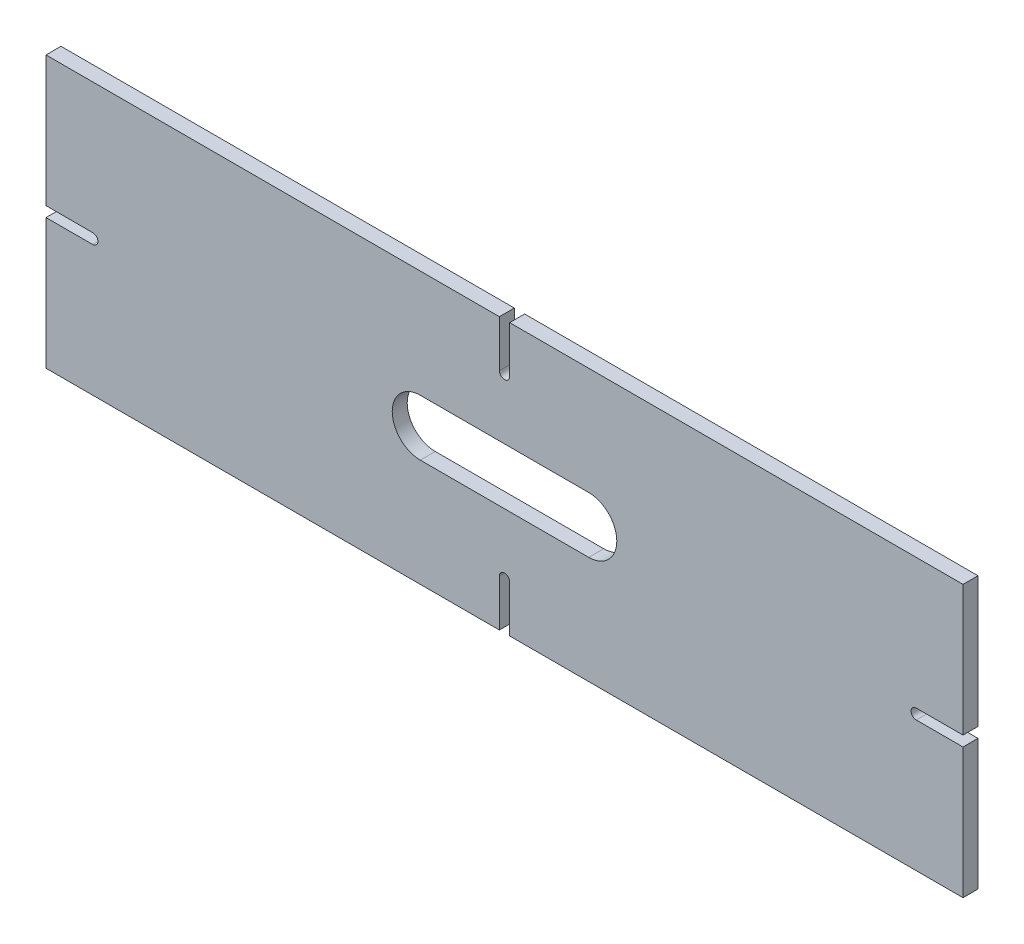
ISO-10303-21;
HEADER;
FILE_DESCRIPTION(('STEP AP214'),'2;1');
FILE_NAME('part.step','',(''),(''),'','','');
FILE_SCHEMA(('AUTOMOTIVE_DESIGN { 1 0 10303 214 1 1 1 1 }'));
ENDSEC;
DATA;
#1=APPLICATION_CONTEXT('core data for automotive mechanical design processes');
#2=APPLICATION_PROTOCOL_DEFINITION('international standard','automotive_design',2000,#1);
#3=PRODUCT_CONTEXT('',#1,'mechanical');
#4=PRODUCT('Part','Part','',(#3));
#5=PRODUCT_RELATED_PRODUCT_CATEGORY('part','',(#4));
#6=PRODUCT_DEFINITION_FORMATION('','',#4);
#7=PRODUCT_DEFINITION_CONTEXT('part definition',#1,'design');
#8=PRODUCT_DEFINITION('design','',#6,#7);
#9=PRODUCT_DEFINITION_SHAPE('','',#8);
#10=(LENGTH_UNIT() NAMED_UNIT(*) SI_UNIT(.MILLI.,.METRE.));
#11=(NAMED_UNIT(*) PLANE_ANGLE_UNIT() SI_UNIT($,.RADIAN.));
#12=(NAMED_UNIT(*) SI_UNIT($,.STERADIAN.) SOLID_ANGLE_UNIT());
#13=UNCERTAINTY_MEASURE_WITH_UNIT(LENGTH_MEASURE(1.E-05),#10,'distance_accuracy_value','');
#14=(GEOMETRIC_REPRESENTATION_CONTEXT(3) GLOBAL_UNCERTAINTY_ASSIGNED_CONTEXT((#13)) GLOBAL_UNIT_ASSIGNED_CONTEXT((#10,
#11,#12)) REPRESENTATION_CONTEXT('',''));
#15=CARTESIAN_POINT('',(0.,0.,0.));
#16=DIRECTION('',(0.,0.,1.));
#17=DIRECTION('',(1.,0.,0.));
#18=AXIS2_PLACEMENT_3D('',#15,#16,#17);
#19=CARTESIAN_POINT('',(-220.,0.,8.));
#20=DIRECTION('',(0.,0.,-1.));
#21=DIRECTION('',(-1.,0.,0.));
#22=AXIS2_PLACEMENT_3D('',#19,#20,#21);
#23=CYLINDRICAL_SURFACE('',#22,2.75);
#24=CARTESIAN_POINT('',(-220.,0.,0.));
#25=DIRECTION('',(0.,0.,1.));
#26=DIRECTION('',(1.,0.,0.));
#27=AXIS2_PLACEMENT_3D('',#24,#25,#26);
#28=CIRCLE('',#27,2.75);
#29=CARTESIAN_POINT('',(-220.,-2.75,0.));
#30=VERTEX_POINT('',#29);
#31=CARTESIAN_POINT('',(-220.,2.75,0.));
#32=VERTEX_POINT('',#31);
#33=EDGE_CURVE('E327',#30,#32,#28,.T.);
#34=ORIENTED_EDGE('',*,*,#33,.F.);
#35=DIRECTION('',(0.,0.,-1.));
#36=VECTOR('',#35,1.);
#37=CARTESIAN_POINT('',(-220.,-2.75,8.));
#38=LINE('',#37,#36);
#39=CARTESIAN_POINT('',(-220.,-2.75,8.));
#40=VERTEX_POINT('',#39);
#41=EDGE_CURVE('E11',#40,#30,#38,.T.);
#42=ORIENTED_EDGE('',*,*,#41,.F.);
#43=CARTESIAN_POINT('',(-220.,0.,8.));
#44=DIRECTION('',(0.,0.,1.));
#45=DIRECTION('',(1.,0.,0.));
#46=AXIS2_PLACEMENT_3D('',#43,#44,#45);
#47=CIRCLE('',#46,2.75);
#48=CARTESIAN_POINT('',(-220.,2.75,8.));
#49=VERTEX_POINT('',#48);
#50=EDGE_CURVE('E241',#40,#49,#47,.T.);
#51=ORIENTED_EDGE('',*,*,#50,.T.);
#52=DIRECTION('',(0.,0.,-1.));
#53=VECTOR('',#52,1.);
#54=CARTESIAN_POINT('',(-220.,2.75,8.));
#55=LINE('',#54,#53);
#56=EDGE_CURVE('E134',#49,#32,#55,.T.);
#57=ORIENTED_EDGE('',*,*,#56,.T.);
#58=EDGE_LOOP('',(#34,#42,#51,#57));
#59=FACE_BOUND('',#58,.T.);
#60=ADVANCED_FACE('F33',(#59),#23,.F.);
#61=CARTESIAN_POINT('',(0.,-2.75,8.));
#62=DIRECTION('',(0.,1.,0.));
#63=DIRECTION('',(0.,0.,1.));
#64=AXIS2_PLACEMENT_3D('',#61,#62,#63);
#65=PLANE('',#64);
#66=DIRECTION('',(1.,0.,0.));
#67=VECTOR('',#66,1.);
#68=CARTESIAN_POINT('',(0.,-2.75,0.));
#69=LINE('',#68,#67);
#70=CARTESIAN_POINT('',(-245.,-2.75,0.));
#71=VERTEX_POINT('',#70);
#72=EDGE_CURVE('E329',#71,#30,#69,.T.);
#73=ORIENTED_EDGE('',*,*,#72,.F.);
#74=DIRECTION('',(0.,0.,-1.));
#75=VECTOR('',#74,1.);
#76=CARTESIAN_POINT('',(-245.,-2.75,8.));
#77=LINE('',#76,#75);
#78=CARTESIAN_POINT('',(-245.,-2.75,8.));
#79=VERTEX_POINT('',#78);
#80=EDGE_CURVE('E43',#79,#71,#77,.T.);
#81=ORIENTED_EDGE('',*,*,#80,.F.);
#82=DIRECTION('',(1.,0.,0.));
#83=VECTOR('',#82,1.);
#84=CARTESIAN_POINT('',(0.,-2.75,8.));
#85=LINE('',#84,#83);
#86=EDGE_CURVE('E234',#79,#40,#85,.T.);
#87=ORIENTED_EDGE('',*,*,#86,.T.);
#88=ORIENTED_EDGE('',*,*,#41,.T.);
#89=EDGE_LOOP('',(#73,#81,#87,#88));
#90=FACE_BOUND('',#89,.T.);
#91=ADVANCED_FACE('F454',(#90),#65,.T.);
#92=CARTESIAN_POINT('',(-245.,0.,8.));
#93=DIRECTION('',(-1.,0.,0.));
#94=DIRECTION('',(0.,0.,1.));
#95=AXIS2_PLACEMENT_3D('',#92,#93,#94);
#96=PLANE('',#95);
#97=DIRECTION('',(0.,1.,0.));
#98=VECTOR('',#97,1.);
#99=CARTESIAN_POINT('',(-245.,0.,0.));
#100=LINE('',#99,#98);
#101=CARTESIAN_POINT('',(-245.,-72.5,0.));
#102=VERTEX_POINT('',#101);
#103=EDGE_CURVE('E260',#102,#71,#100,.T.);
#104=ORIENTED_EDGE('',*,*,#103,.F.);
#105=DIRECTION('',(0.,0.,-1.));
#106=VECTOR('',#105,1.);
#107=CARTESIAN_POINT('',(-245.,-72.5,8.));
#108=LINE('',#107,#106);
#109=CARTESIAN_POINT('',(-245.,-72.5,8.));
#110=VERTEX_POINT('',#109);
#111=EDGE_CURVE('E297',#110,#102,#108,.T.);
#112=ORIENTED_EDGE('',*,*,#111,.F.);
#113=DIRECTION('',(0.,1.,0.));
#114=VECTOR('',#113,1.);
#115=CARTESIAN_POINT('',(-245.,0.,8.));
#116=LINE('',#115,#114);
#117=EDGE_CURVE('E227',#110,#79,#116,.T.);
#118=ORIENTED_EDGE('',*,*,#117,.T.);
#119=ORIENTED_EDGE('',*,*,#80,.T.);
#120=EDGE_LOOP('',(#104,#112,#118,#119));
#121=FACE_BOUND('',#120,.T.);
#122=ADVANCED_FACE('F453',(#121),#96,.T.);
#123=CARTESIAN_POINT('',(0.,-72.5,8.));
#124=DIRECTION('',(0.,1.,0.));
#125=DIRECTION('',(0.,0.,1.));
#126=AXIS2_PLACEMENT_3D('',#123,#124,#125);
#127=PLANE('',#126);
#128=DIRECTION('',(1.,0.,0.));
#129=VECTOR('',#128,1.);
#130=CARTESIAN_POINT('',(0.,-72.5,0.));
#131=LINE('',#130,#129);
#132=CARTESIAN_POINT('',(-2.75,-72.5,0.));
#133=VERTEX_POINT('',#132);
#134=EDGE_CURVE('E333',#102,#133,#131,.T.);
#135=ORIENTED_EDGE('',*,*,#134,.T.);
#136=DIRECTION('',(0.,0.,-1.));
#137=VECTOR('',#136,1.);
#138=CARTESIAN_POINT('',(-2.75,-72.5,8.));
#139=LINE('',#138,#137);
#140=CARTESIAN_POINT('',(-2.75,-72.5,8.));
#141=VERTEX_POINT('',#140);
#142=EDGE_CURVE('E294',#141,#133,#139,.T.);
#143=ORIENTED_EDGE('',*,*,#142,.F.);
#144=DIRECTION('',(1.,0.,0.));
#145=VECTOR('',#144,1.);
#146=CARTESIAN_POINT('',(0.,-72.5,8.));
#147=LINE('',#146,#145);
#148=EDGE_CURVE('E233',#110,#141,#147,.T.);
#149=ORIENTED_EDGE('',*,*,#148,.F.);
#150=ORIENTED_EDGE('',*,*,#111,.T.);
#151=EDGE_LOOP('',(#135,#143,#149,#150));
#152=FACE_BOUND('',#151,.T.);
#153=ADVANCED_FACE('F376',(#152),#127,.F.);
#154=CARTESIAN_POINT('',(-2.75,0.,8.));
#155=DIRECTION('',(-1.,0.,0.));
#156=DIRECTION('',(0.,0.,1.));
#157=AXIS2_PLACEMENT_3D('',#154,#155,#156);
#158=PLANE('',#157);
#159=DIRECTION('',(0.,1.,0.));
#160=VECTOR('',#159,1.);
#161=CARTESIAN_POINT('',(-2.75,0.,0.));
#162=LINE('',#161,#160);
#163=CARTESIAN_POINT('',(-2.75,-47.5,0.));
#164=VERTEX_POINT('',#163);
#165=EDGE_CURVE('E336',#133,#164,#162,.T.);
#166=ORIENTED_EDGE('',*,*,#165,.T.);
#167=DIRECTION('',(0.,0.,-1.));
#168=VECTOR('',#167,1.);
#169=CARTESIAN_POINT('',(-2.75,-47.5,8.));
#170=LINE('',#169,#168);
#171=CARTESIAN_POINT('',(-2.75,-47.5,8.));
#172=VERTEX_POINT('',#171);
#173=EDGE_CURVE('E292',#172,#164,#170,.T.);
#174=ORIENTED_EDGE('',*,*,#173,.F.);
#175=DIRECTION('',(0.,1.,0.));
#176=VECTOR('',#175,1.);
#177=CARTESIAN_POINT('',(-2.75,0.,8.));
#178=LINE('',#177,#176);
#179=EDGE_CURVE('E238',#141,#172,#178,.T.);
#180=ORIENTED_EDGE('',*,*,#179,.F.);
#181=ORIENTED_EDGE('',*,*,#142,.T.);
#182=EDGE_LOOP('',(#166,#174,#180,#181));
#183=FACE_BOUND('',#182,.T.);
#184=ADVANCED_FACE('F379',(#183),#158,.F.);
#185=CARTESIAN_POINT('',(0.,-47.5,8.));
#186=DIRECTION('',(0.,0.,-1.));
#187=DIRECTION('',(-1.,0.,0.));
#188=AXIS2_PLACEMENT_3D('',#185,#186,#187);
#189=CYLINDRICAL_SURFACE('',#188,2.75);
#190=CARTESIAN_POINT('',(0.,-47.5,0.));
#191=DIRECTION('',(0.,0.,1.));
#192=DIRECTION('',(1.,0.,0.));
#193=AXIS2_PLACEMENT_3D('',#190,#191,#192);
#194=CIRCLE('',#193,2.75);
#195=CARTESIAN_POINT('',(2.75,-47.5,0.));
#196=VERTEX_POINT('',#195);
#197=EDGE_CURVE('E340',#196,#164,#194,.T.);
#198=ORIENTED_EDGE('',*,*,#197,.F.);
#199=DIRECTION('',(0.,0.,-1.));
#200=VECTOR('',#199,1.);
#201=CARTESIAN_POINT('',(2.75,-47.5,8.));
#202=LINE('',#201,#200);
#203=CARTESIAN_POINT('',(2.75,-47.5,8.));
#204=VERTEX_POINT('',#203);
#205=EDGE_CURVE('E290',#204,#196,#202,.T.);
#206=ORIENTED_EDGE('',*,*,#205,.F.);
#207=CARTESIAN_POINT('',(0.,-47.5,8.));
#208=DIRECTION('',(0.,0.,1.));
#209=DIRECTION('',(1.,0.,0.));
#210=AXIS2_PLACEMENT_3D('',#207,#208,#209);
#211=CIRCLE('',#210,2.75);
#212=EDGE_CURVE('E381',#204,#172,#211,.T.);
#213=ORIENTED_EDGE('',*,*,#212,.T.);
#214=ORIENTED_EDGE('',*,*,#173,.T.);
#215=EDGE_LOOP('',(#198,#206,#213,#214));
#216=FACE_BOUND('',#215,.T.);
#217=ADVANCED_FACE('F451',(#216),#189,.F.);
#218=CARTESIAN_POINT('',(2.75,0.,8.));
#219=DIRECTION('',(-1.,0.,0.));
#220=DIRECTION('',(0.,0.,1.));
#221=AXIS2_PLACEMENT_3D('',#218,#219,#220);
#222=PLANE('',#221);
#223=DIRECTION('',(0.,1.,0.));
#224=VECTOR('',#223,1.);
#225=CARTESIAN_POINT('',(2.75,0.,0.));
#226=LINE('',#225,#224);
#227=CARTESIAN_POINT('',(2.75,-72.5,0.));
#228=VERTEX_POINT('',#227);
#229=EDGE_CURVE('E343',#228,#196,#226,.T.);
#230=ORIENTED_EDGE('',*,*,#229,.F.);
#231=DIRECTION('',(0.,0.,-1.));
#232=VECTOR('',#231,1.);
#233=CARTESIAN_POINT('',(2.75,-72.5,8.));
#234=LINE('',#233,#232);
#235=CARTESIAN_POINT('',(2.75,-72.5,8.));
#236=VERTEX_POINT('',#235);
#237=EDGE_CURVE('E288',#236,#228,#234,.T.);
#238=ORIENTED_EDGE('',*,*,#237,.F.);
#239=DIRECTION('',(0.,1.,0.));
#240=VECTOR('',#239,1.);
#241=CARTESIAN_POINT('',(2.75,0.,8.));
#242=LINE('',#241,#240);
#243=EDGE_CURVE('E383',#236,#204,#242,.T.);
#244=ORIENTED_EDGE('',*,*,#243,.T.);
#245=ORIENTED_EDGE('',*,*,#205,.T.);
#246=EDGE_LOOP('',(#230,#238,#244,#245));
#247=FACE_BOUND('',#246,.T.);
#248=ADVANCED_FACE('F447',(#247),#222,.T.);
#249=CARTESIAN_POINT('',(245.,-72.5,0.));
#250=VERTEX_POINT('',#249);
#251=EDGE_CURVE('E337',#228,#250,#131,.T.);
#252=ORIENTED_EDGE('',*,*,#251,.T.);
#253=DIRECTION('',(0.,0.,-1.));
#254=VECTOR('',#253,1.);
#255=CARTESIAN_POINT('',(245.,-72.5,8.));
#256=LINE('',#255,#254);
#257=CARTESIAN_POINT('',(245.,-72.5,8.));
#258=VERTEX_POINT('',#257);
#259=EDGE_CURVE('E285',#258,#250,#256,.T.);
#260=ORIENTED_EDGE('',*,*,#259,.F.);
#261=EDGE_CURVE('E239',#236,#258,#147,.T.);
#262=ORIENTED_EDGE('',*,*,#261,.F.);
#263=ORIENTED_EDGE('',*,*,#237,.T.);
#264=EDGE_LOOP('',(#252,#260,#262,#263));
#265=FACE_BOUND('',#264,.T.);
#266=ADVANCED_FACE('F444',(#265),#127,.F.);
#267=CARTESIAN_POINT('',(245.,0.,8.));
#268=DIRECTION('',(-1.,0.,0.));
#269=DIRECTION('',(0.,0.,1.));
#270=AXIS2_PLACEMENT_3D('',#267,#268,#269);
#271=PLANE('',#270);
#272=DIRECTION('',(0.,1.,0.));
#273=VECTOR('',#272,1.);
#274=CARTESIAN_POINT('',(245.,0.,0.));
#275=LINE('',#274,#273);
#276=CARTESIAN_POINT('',(245.,-2.75,0.));
#277=VERTEX_POINT('',#276);
#278=EDGE_CURVE('E346',#250,#277,#275,.T.);
#279=ORIENTED_EDGE('',*,*,#278,.T.);
#280=DIRECTION('',(0.,0.,-1.));
#281=VECTOR('',#280,1.);
#282=CARTESIAN_POINT('',(245.,-2.75,8.));
#283=LINE('',#282,#281);
#284=CARTESIAN_POINT('',(245.,-2.75,8.));
#285=VERTEX_POINT('',#284);
#286=EDGE_CURVE('E282',#285,#277,#283,.T.);
#287=ORIENTED_EDGE('',*,*,#286,.F.);
#288=DIRECTION('',(0.,1.,0.));
#289=VECTOR('',#288,1.);
#290=CARTESIAN_POINT('',(245.,0.,8.));
#291=LINE('',#290,#289);
#292=EDGE_CURVE('E388',#258,#285,#291,.T.);
#293=ORIENTED_EDGE('',*,*,#292,.F.);
#294=ORIENTED_EDGE('',*,*,#259,.T.);
#295=EDGE_LOOP('',(#279,#287,#293,#294));
#296=FACE_BOUND('',#295,.T.);
#297=ADVANCED_FACE('F438',(#296),#271,.F.);
#298=CARTESIAN_POINT('',(0.,-2.75,8.));
#299=DIRECTION('',(0.,-1.,0.));
#300=DIRECTION('',(0.,0.,-1.));
#301=AXIS2_PLACEMENT_3D('',#298,#299,#300);
#302=PLANE('',#301);
#303=DIRECTION('',(-1.,0.,0.));
#304=VECTOR('',#303,1.);
#305=CARTESIAN_POINT('',(0.,-2.75,0.));
#306=LINE('',#305,#304);
#307=CARTESIAN_POINT('',(220.,-2.75,0.));
#308=VERTEX_POINT('',#307);
#309=EDGE_CURVE('E349',#277,#308,#306,.T.);
#310=ORIENTED_EDGE('',*,*,#309,.T.);
#311=DIRECTION('',(0.,0.,-1.));
#312=VECTOR('',#311,1.);
#313=CARTESIAN_POINT('',(220.,-2.75,8.));
#314=LINE('',#313,#312);
#315=CARTESIAN_POINT('',(220.,-2.75,8.));
#316=VERTEX_POINT('',#315);
#317=EDGE_CURVE('E280',#316,#308,#314,.T.);
#318=ORIENTED_EDGE('',*,*,#317,.F.);
#319=DIRECTION('',(-1.,0.,0.));
#320=VECTOR('',#319,1.);
#321=CARTESIAN_POINT('',(0.,-2.75,8.));
#322=LINE('',#321,#320);
#323=EDGE_CURVE('E391',#285,#316,#322,.T.);
#324=ORIENTED_EDGE('',*,*,#323,.F.);
#325=ORIENTED_EDGE('',*,*,#286,.T.);
#326=EDGE_LOOP('',(#310,#318,#324,#325));
#327=FACE_BOUND('',#326,.T.);
#328=ADVANCED_FACE('F436',(#327),#302,.F.);
#329=CARTESIAN_POINT('',(220.,0.,8.));
#330=DIRECTION('',(0.,0.,-1.));
#331=DIRECTION('',(-1.,0.,0.));
#332=AXIS2_PLACEMENT_3D('',#329,#330,#331);
#333=CYLINDRICAL_SURFACE('',#332,2.75);
#334=CARTESIAN_POINT('',(220.,0.,0.));
#335=DIRECTION('',(0.,0.,1.));
#336=DIRECTION('',(1.,0.,0.));
#337=AXIS2_PLACEMENT_3D('',#334,#335,#336);
#338=CIRCLE('',#337,2.75);
#339=CARTESIAN_POINT('',(220.,2.75,0.));
#340=VERTEX_POINT('',#339);
#341=EDGE_CURVE('E353',#340,#308,#338,.T.);
#342=ORIENTED_EDGE('',*,*,#341,.F.);
#343=DIRECTION('',(0.,0.,-1.));
#344=VECTOR('',#343,1.);
#345=CARTESIAN_POINT('',(220.,2.75,8.));
#346=LINE('',#345,#344);
#347=CARTESIAN_POINT('',(220.,2.75,8.));
#348=VERTEX_POINT('',#347);
#349=EDGE_CURVE('E278',#348,#340,#346,.T.);
#350=ORIENTED_EDGE('',*,*,#349,.F.);
#351=CARTESIAN_POINT('',(220.,0.,8.));
#352=DIRECTION('',(0.,0.,1.));
#353=DIRECTION('',(1.,0.,0.));
#354=AXIS2_PLACEMENT_3D('',#351,#352,#353);
#355=CIRCLE('',#354,2.75);
#356=EDGE_CURVE('E394',#348,#316,#355,.T.);
#357=ORIENTED_EDGE('',*,*,#356,.T.);
#358=ORIENTED_EDGE('',*,*,#317,.T.);
#359=EDGE_LOOP('',(#342,#350,#357,#358));
#360=FACE_BOUND('',#359,.T.);
#361=ADVANCED_FACE('F431',(#360),#333,.F.);
#362=CARTESIAN_POINT('',(0.,2.75,8.));
#363=DIRECTION('',(0.,-1.,0.));
#364=DIRECTION('',(0.,0.,-1.));
#365=AXIS2_PLACEMENT_3D('',#362,#363,#364);
#366=PLANE('',#365);
#367=DIRECTION('',(-1.,0.,0.));
#368=VECTOR('',#367,1.);
#369=CARTESIAN_POINT('',(0.,2.75,0.));
#370=LINE('',#369,#368);
#371=CARTESIAN_POINT('',(245.,2.75,0.));
#372=VERTEX_POINT('',#371);
#373=EDGE_CURVE('E356',#372,#340,#370,.T.);
#374=ORIENTED_EDGE('',*,*,#373,.F.);
#375=DIRECTION('',(0.,0.,-1.));
#376=VECTOR('',#375,1.);
#377=CARTESIAN_POINT('',(245.,2.75,8.));
#378=LINE('',#377,#376);
#379=CARTESIAN_POINT('',(245.,2.75,8.));
#380=VERTEX_POINT('',#379);
#381=EDGE_CURVE('E276',#380,#372,#378,.T.);
#382=ORIENTED_EDGE('',*,*,#381,.F.);
#383=DIRECTION('',(-1.,0.,0.));
#384=VECTOR('',#383,1.);
#385=CARTESIAN_POINT('',(0.,2.75,8.));
#386=LINE('',#385,#384);
#387=EDGE_CURVE('E397',#380,#348,#386,.T.);
#388=ORIENTED_EDGE('',*,*,#387,.T.);
#389=ORIENTED_EDGE('',*,*,#349,.T.);
#390=EDGE_LOOP('',(#374,#382,#388,#389));
#391=FACE_BOUND('',#390,.T.);
#392=ADVANCED_FACE('F426',(#391),#366,.T.);
#393=CARTESIAN_POINT('',(245.,72.5,0.));
#394=VERTEX_POINT('',#393);
#395=EDGE_CURVE('E350',#372,#394,#275,.T.);
#396=ORIENTED_EDGE('',*,*,#395,.T.);
#397=DIRECTION('',(0.,0.,-1.));
#398=VECTOR('',#397,1.);
#399=CARTESIAN_POINT('',(245.,72.5,8.));
#400=LINE('',#399,#398);
#401=CARTESIAN_POINT('',(245.,72.5,8.));
#402=VERTEX_POINT('',#401);
#403=EDGE_CURVE('E274',#402,#394,#400,.T.);
#404=ORIENTED_EDGE('',*,*,#403,.F.);
#405=EDGE_CURVE('E392',#380,#402,#291,.T.);
#406=ORIENTED_EDGE('',*,*,#405,.F.);
#407=ORIENTED_EDGE('',*,*,#381,.T.);
#408=EDGE_LOOP('',(#396,#404,#406,#407));
#409=FACE_BOUND('',#408,.T.);
#410=ADVANCED_FACE('F423',(#409),#271,.F.);
#411=CARTESIAN_POINT('',(0.,72.5,8.));
#412=DIRECTION('',(0.,1.,0.));
#413=DIRECTION('',(-1.,0.,0.));
#414=AXIS2_PLACEMENT_3D('',#411,#412,#413);
#415=PLANE('',#414);
#416=DIRECTION('',(1.,0.,0.));
#417=VECTOR('',#416,1.);
#418=CARTESIAN_POINT('',(0.,72.5,0.));
#419=LINE('',#418,#417);
#420=CARTESIAN_POINT('',(2.75,72.5,0.));
#421=VERTEX_POINT('',#420);
#422=EDGE_CURVE('E359',#421,#394,#419,.T.);
#423=ORIENTED_EDGE('',*,*,#422,.F.);
#424=DIRECTION('',(0.,0.,-1.));
#425=VECTOR('',#424,1.);
#426=CARTESIAN_POINT('',(2.75,72.5,8.));
#427=LINE('',#426,#425);
#428=CARTESIAN_POINT('',(2.75,72.5,8.));
#429=VERTEX_POINT('',#428);
#430=EDGE_CURVE('E272',#429,#421,#427,.T.);
#431=ORIENTED_EDGE('',*,*,#430,.F.);
#432=DIRECTION('',(1.,0.,0.));
#433=VECTOR('',#432,1.);
#434=CARTESIAN_POINT('',(0.,72.5,8.));
#435=LINE('',#434,#433);
#436=EDGE_CURVE('E224',#429,#402,#435,.T.);
#437=ORIENTED_EDGE('',*,*,#436,.T.);
#438=ORIENTED_EDGE('',*,*,#403,.T.);
#439=EDGE_LOOP('',(#423,#431,#437,#438));
#440=FACE_BOUND('',#439,.T.);
#441=ADVANCED_FACE('F417',(#440),#415,.T.);
#442=CARTESIAN_POINT('',(2.75,0.,8.));
#443=DIRECTION('',(1.,0.,0.));
#444=DIRECTION('',(0.,0.,-1.));
#445=AXIS2_PLACEMENT_3D('',#442,#443,#444);
#446=PLANE('',#445);
#447=DIRECTION('',(0.,-1.,0.));
#448=VECTOR('',#447,1.);
#449=CARTESIAN_POINT('',(2.75,0.,0.));
#450=LINE('',#449,#448);
#451=CARTESIAN_POINT('',(2.75,47.5,0.));
#452=VERTEX_POINT('',#451);
#453=EDGE_CURVE('E362',#421,#452,#450,.T.);
#454=ORIENTED_EDGE('',*,*,#453,.T.);
#455=DIRECTION('',(0.,0.,-1.));
#456=VECTOR('',#455,1.);
#457=CARTESIAN_POINT('',(2.75,47.5,8.));
#458=LINE('',#457,#456);
#459=CARTESIAN_POINT('',(2.75,47.5,8.));
#460=VERTEX_POINT('',#459);
#461=EDGE_CURVE('E270',#460,#452,#458,.T.);
#462=ORIENTED_EDGE('',*,*,#461,.F.);
#463=DIRECTION('',(0.,-1.,0.));
#464=VECTOR('',#463,1.);
#465=CARTESIAN_POINT('',(2.75,0.,8.));
#466=LINE('',#465,#464);
#467=EDGE_CURVE('E401',#429,#460,#466,.T.);
#468=ORIENTED_EDGE('',*,*,#467,.F.);
#469=ORIENTED_EDGE('',*,*,#430,.T.);
#470=EDGE_LOOP('',(#454,#462,#468,#469));
#471=FACE_BOUND('',#470,.T.);
#472=ADVANCED_FACE('F413',(#471),#446,.F.);
#473=CARTESIAN_POINT('',(0.,47.5,8.));
#474=DIRECTION('',(0.,0.,-1.));
#475=DIRECTION('',(-1.,0.,0.));
#476=AXIS2_PLACEMENT_3D('',#473,#474,#475);
#477=CYLINDRICAL_SURFACE('',#476,2.75);
#478=CARTESIAN_POINT('',(0.,47.5,0.));
#479=DIRECTION('',(0.,0.,1.));
#480=DIRECTION('',(1.,0.,0.));
#481=AXIS2_PLACEMENT_3D('',#478,#479,#480);
#482=CIRCLE('',#481,2.75);
#483=CARTESIAN_POINT('',(-2.75,47.5,0.));
#484=VERTEX_POINT('',#483);
#485=EDGE_CURVE('E364',#484,#452,#482,.T.);
#486=ORIENTED_EDGE('',*,*,#485,.F.);
#487=DIRECTION('',(0.,0.,-1.));
#488=VECTOR('',#487,1.);
#489=CARTESIAN_POINT('',(-2.75,47.5,8.));
#490=LINE('',#489,#488);
#491=CARTESIAN_POINT('',(-2.75,47.5,8.));
#492=VERTEX_POINT('',#491);
#493=EDGE_CURVE('E268',#492,#484,#490,.T.);
#494=ORIENTED_EDGE('',*,*,#493,.F.);
#495=CARTESIAN_POINT('',(0.,47.5,8.));
#496=DIRECTION('',(0.,0.,1.));
#497=DIRECTION('',(1.,0.,0.));
#498=AXIS2_PLACEMENT_3D('',#495,#496,#497);
#499=CIRCLE('',#498,2.75);
#500=EDGE_CURVE('E403',#492,#460,#499,.T.);
#501=ORIENTED_EDGE('',*,*,#500,.T.);
#502=ORIENTED_EDGE('',*,*,#461,.T.);
#503=EDGE_LOOP('',(#486,#494,#501,#502));
#504=FACE_BOUND('',#503,.T.);
#505=ADVANCED_FACE('F409',(#504),#477,.F.);
#506=CARTESIAN_POINT('',(-2.75,0.,8.));
#507=DIRECTION('',(1.,0.,0.));
#508=DIRECTION('',(0.,0.,-1.));
#509=AXIS2_PLACEMENT_3D('',#506,#507,#508);
#510=PLANE('',#509);
#511=DIRECTION('',(0.,-1.,0.));
#512=VECTOR('',#511,1.);
#513=CARTESIAN_POINT('',(-2.75,0.,0.));
#514=LINE('',#513,#512);
#515=CARTESIAN_POINT('',(-2.75,72.5,0.));
#516=VERTEX_POINT('',#515);
#517=EDGE_CURVE('E263',#516,#484,#514,.T.);
#518=ORIENTED_EDGE('',*,*,#517,.F.);
#519=DIRECTION('',(0.,0.,-1.));
#520=VECTOR('',#519,1.);
#521=CARTESIAN_POINT('',(-2.75,72.5,8.));
#522=LINE('',#521,#520);
#523=CARTESIAN_POINT('',(-2.75,72.5,8.));
#524=VERTEX_POINT('',#523);
#525=EDGE_CURVE('E215',#524,#516,#522,.T.);
#526=ORIENTED_EDGE('',*,*,#525,.F.);
#527=DIRECTION('',(0.,-1.,0.));
#528=VECTOR('',#527,1.);
#529=CARTESIAN_POINT('',(-2.75,0.,8.));
#530=LINE('',#529,#528);
#531=EDGE_CURVE('E222',#524,#492,#530,.T.);
#532=ORIENTED_EDGE('',*,*,#531,.T.);
#533=ORIENTED_EDGE('',*,*,#493,.T.);
#534=EDGE_LOOP('',(#518,#526,#532,#533));
#535=FACE_BOUND('',#534,.T.);
#536=ADVANCED_FACE('F407',(#535),#510,.T.);
#537=CARTESIAN_POINT('',(-245.,72.5,0.));
#538=VERTEX_POINT('',#537);
#539=EDGE_CURVE('E210',#538,#516,#419,.T.);
#540=ORIENTED_EDGE('',*,*,#539,.F.);
#541=DIRECTION('',(0.,0.,-1.));
#542=VECTOR('',#541,1.);
#543=CARTESIAN_POINT('',(-245.,72.5,8.));
#544=LINE('',#543,#542);
#545=CARTESIAN_POINT('',(-245.,72.5,8.));
#546=VERTEX_POINT('',#545);
#547=EDGE_CURVE('E205',#546,#538,#544,.T.);
#548=ORIENTED_EDGE('',*,*,#547,.F.);
#549=EDGE_CURVE('E208',#546,#524,#435,.T.);
#550=ORIENTED_EDGE('',*,*,#549,.T.);
#551=ORIENTED_EDGE('',*,*,#525,.T.);
#552=EDGE_LOOP('',(#540,#548,#550,#551));
#553=FACE_BOUND('',#552,.T.);
#554=ADVANCED_FACE('F207',(#553),#415,.T.);
#555=CARTESIAN_POINT('',(-245.,2.75,0.));
#556=VERTEX_POINT('',#555);
#557=EDGE_CURVE('E256',#556,#538,#100,.T.);
#558=ORIENTED_EDGE('',*,*,#557,.F.);
#559=DIRECTION('',(0.,0.,-1.));
#560=VECTOR('',#559,1.);
#561=CARTESIAN_POINT('',(-245.,2.75,8.));
#562=LINE('',#561,#560);
#563=CARTESIAN_POINT('',(-245.,2.75,8.));
#564=VERTEX_POINT('',#563);
#565=EDGE_CURVE('E127',#564,#556,#562,.T.);
#566=ORIENTED_EDGE('',*,*,#565,.F.);
#567=EDGE_CURVE('E219',#564,#546,#116,.T.);
#568=ORIENTED_EDGE('',*,*,#567,.T.);
#569=ORIENTED_EDGE('',*,*,#547,.T.);
#570=EDGE_LOOP('',(#558,#566,#568,#569));
#571=FACE_BOUND('',#570,.T.);
#572=ADVANCED_FACE('F225',(#571),#96,.T.);
#573=CARTESIAN_POINT('',(45.,0.,8.));
#574=DIRECTION('',(0.,0.,-1.));
#575=DIRECTION('',(-1.,0.,0.));
#576=AXIS2_PLACEMENT_3D('',#573,#574,#575);
#577=CYLINDRICAL_SURFACE('',#576,15.);
#578=CARTESIAN_POINT('',(45.,0.,0.));
#579=DIRECTION('',(0.,0.,1.));
#580=DIRECTION('',(1.,0.,0.));
#581=AXIS2_PLACEMENT_3D('',#578,#579,#580);
#582=CIRCLE('',#581,15.);
#583=CARTESIAN_POINT('',(45.,-15.,0.));
#584=VERTEX_POINT('',#583);
#585=CARTESIAN_POINT('',(45.,15.,0.));
#586=VERTEX_POINT('',#585);
#587=EDGE_CURVE('E313',#584,#586,#582,.T.);
#588=ORIENTED_EDGE('',*,*,#587,.F.);
#589=DIRECTION('',(0.,0.,-1.));
#590=VECTOR('',#589,1.);
#591=CARTESIAN_POINT('',(45.,-15.,8.));
#592=LINE('',#591,#590);
#593=CARTESIAN_POINT('',(45.,-15.,8.));
#594=VERTEX_POINT('',#593);
#595=EDGE_CURVE('E37',#594,#584,#592,.T.);
#596=ORIENTED_EDGE('',*,*,#595,.F.);
#597=CARTESIAN_POINT('',(45.,0.,8.));
#598=DIRECTION('',(0.,0.,1.));
#599=DIRECTION('',(1.,0.,0.));
#600=AXIS2_PLACEMENT_3D('',#597,#598,#599);
#601=CIRCLE('',#600,15.);
#602=CARTESIAN_POINT('',(45.,15.,8.));
#603=VERTEX_POINT('',#602);
#604=EDGE_CURVE('E254',#594,#603,#601,.T.);
#605=ORIENTED_EDGE('',*,*,#604,.T.);
#606=DIRECTION('',(0.,0.,-1.));
#607=VECTOR('',#606,1.);
#608=CARTESIAN_POINT('',(45.,15.,8.));
#609=LINE('',#608,#607);
#610=EDGE_CURVE('E228',#603,#586,#609,.T.);
#611=ORIENTED_EDGE('',*,*,#610,.T.);
#612=EDGE_LOOP('',(#588,#596,#605,#611));
#613=FACE_BOUND('',#612,.T.);
#614=ADVANCED_FACE('F35',(#613),#577,.F.);
#615=CARTESIAN_POINT('',(0.,-15.,8.));
#616=DIRECTION('',(0.,1.,0.));
#617=DIRECTION('',(-1.,0.,0.));
#618=AXIS2_PLACEMENT_3D('',#615,#616,#617);
#619=PLANE('',#618);
#620=DIRECTION('',(1.,0.,0.));
#621=VECTOR('',#620,1.);
#622=CARTESIAN_POINT('',(0.,-15.,0.));
#623=LINE('',#622,#621);
#624=CARTESIAN_POINT('',(-45.,-15.,0.));
#625=VERTEX_POINT('',#624);
#626=EDGE_CURVE('E309',#625,#584,#623,.T.);
#627=ORIENTED_EDGE('',*,*,#626,.F.);
#628=DIRECTION('',(0.,0.,-1.));
#629=VECTOR('',#628,1.);
#630=CARTESIAN_POINT('',(-45.,-15.,8.));
#631=LINE('',#630,#629);
#632=CARTESIAN_POINT('',(-45.,-15.,8.));
#633=VERTEX_POINT('',#632);
#634=EDGE_CURVE('E302',#633,#625,#631,.T.);
#635=ORIENTED_EDGE('',*,*,#634,.F.);
#636=DIRECTION('',(1.,0.,0.));
#637=VECTOR('',#636,1.);
#638=CARTESIAN_POINT('',(0.,-15.,8.));
#639=LINE('',#638,#637);
#640=EDGE_CURVE('E251',#633,#594,#639,.T.);
#641=ORIENTED_EDGE('',*,*,#640,.T.);
#642=ORIENTED_EDGE('',*,*,#595,.T.);
#643=EDGE_LOOP('',(#627,#635,#641,#642));
#644=FACE_BOUND('',#643,.T.);
#645=ADVANCED_FACE('F307',(#644),#619,.T.);
#646=CARTESIAN_POINT('',(-45.,0.,8.));
#647=DIRECTION('',(0.,0.,-1.));
#648=DIRECTION('',(-1.,0.,0.));
#649=AXIS2_PLACEMENT_3D('',#646,#647,#648);
#650=CYLINDRICAL_SURFACE('',#649,15.);
#651=CARTESIAN_POINT('',(-45.,0.,0.));
#652=DIRECTION('',(0.,0.,1.));
#653=DIRECTION('',(1.,0.,0.));
#654=AXIS2_PLACEMENT_3D('',#651,#652,#653);
#655=CIRCLE('',#654,15.);
#656=CARTESIAN_POINT('',(-45.,15.,0.));
#657=VERTEX_POINT('',#656);
#658=EDGE_CURVE('E321',#657,#625,#655,.T.);
#659=ORIENTED_EDGE('',*,*,#658,.F.);
#660=DIRECTION('',(0.,0.,-1.));
#661=VECTOR('',#660,1.);
#662=CARTESIAN_POINT('',(-45.,15.,8.));
#663=LINE('',#662,#661);
#664=CARTESIAN_POINT('',(-45.,15.,8.));
#665=VERTEX_POINT('',#664);
#666=EDGE_CURVE('E301',#665,#657,#663,.T.);
#667=ORIENTED_EDGE('',*,*,#666,.F.);
#668=CARTESIAN_POINT('',(-45.,0.,8.));
#669=DIRECTION('',(0.,0.,1.));
#670=DIRECTION('',(1.,0.,0.));
#671=AXIS2_PLACEMENT_3D('',#668,#669,#670);
#672=CIRCLE('',#671,15.);
#673=EDGE_CURVE('E248',#665,#633,#672,.T.);
#674=ORIENTED_EDGE('',*,*,#673,.T.);
#675=ORIENTED_EDGE('',*,*,#634,.T.);
#676=EDGE_LOOP('',(#659,#667,#674,#675));
#677=FACE_BOUND('',#676,.T.);
#678=ADVANCED_FACE('F470',(#677),#650,.F.);
#679=CARTESIAN_POINT('',(0.,15.,8.));
#680=DIRECTION('',(0.,1.,0.));
#681=DIRECTION('',(-1.,0.,0.));
#682=AXIS2_PLACEMENT_3D('',#679,#680,#681);
#683=PLANE('',#682);
#684=DIRECTION('',(1.,0.,0.));
#685=VECTOR('',#684,1.);
#686=CARTESIAN_POINT('',(0.,15.,0.));
#687=LINE('',#686,#685);
#688=EDGE_CURVE('E323',#657,#586,#687,.T.);
#689=ORIENTED_EDGE('',*,*,#688,.T.);
#690=ORIENTED_EDGE('',*,*,#610,.F.);
#691=DIRECTION('',(1.,0.,0.));
#692=VECTOR('',#691,1.);
#693=CARTESIAN_POINT('',(0.,15.,8.));
#694=LINE('',#693,#692);
#695=EDGE_CURVE('E244',#665,#603,#694,.T.);
#696=ORIENTED_EDGE('',*,*,#695,.F.);
#697=ORIENTED_EDGE('',*,*,#666,.T.);
#698=EDGE_LOOP('',(#689,#690,#696,#697));
#699=FACE_BOUND('',#698,.T.);
#700=ADVANCED_FACE('F466',(#699),#683,.F.);
#701=CARTESIAN_POINT('',(0.,2.75,8.));
#702=DIRECTION('',(0.,1.,0.));
#703=DIRECTION('',(0.,0.,1.));
#704=AXIS2_PLACEMENT_3D('',#701,#702,#703);
#705=PLANE('',#704);
#706=DIRECTION('',(1.,0.,0.));
#707=VECTOR('',#706,1.);
#708=CARTESIAN_POINT('',(0.,2.75,0.));
#709=LINE('',#708,#707);
#710=EDGE_CURVE('E255',#556,#32,#709,.T.);
#711=ORIENTED_EDGE('',*,*,#710,.T.);
#712=ORIENTED_EDGE('',*,*,#56,.F.);
#713=DIRECTION('',(1.,0.,0.));
#714=VECTOR('',#713,1.);
#715=CARTESIAN_POINT('',(0.,2.75,8.));
#716=LINE('',#715,#714);
#717=EDGE_CURVE('E52',#564,#49,#716,.T.);
#718=ORIENTED_EDGE('',*,*,#717,.F.);
#719=ORIENTED_EDGE('',*,*,#565,.T.);
#720=EDGE_LOOP('',(#711,#712,#718,#719));
#721=FACE_BOUND('',#720,.T.);
#722=ADVANCED_FACE('F469',(#721),#705,.F.);
#723=CARTESIAN_POINT('',(0.,0.,8.));
#724=DIRECTION('',(0.,0.,1.));
#725=DIRECTION('',(1.,0.,0.));
#726=AXIS2_PLACEMENT_3D('',#723,#724,#725);
#727=PLANE('',#726);
#728=ORIENTED_EDGE('',*,*,#604,.F.);
#729=ORIENTED_EDGE('',*,*,#640,.F.);
#730=ORIENTED_EDGE('',*,*,#673,.F.);
#731=ORIENTED_EDGE('',*,*,#695,.T.);
#732=EDGE_LOOP('',(#728,#729,#730,#731));
#733=FACE_BOUND('',#732,.T.);
#734=ORIENTED_EDGE('',*,*,#50,.F.);
#735=ORIENTED_EDGE('',*,*,#86,.F.);
#736=ORIENTED_EDGE('',*,*,#117,.F.);
#737=ORIENTED_EDGE('',*,*,#148,.T.);
#738=ORIENTED_EDGE('',*,*,#179,.T.);
#739=ORIENTED_EDGE('',*,*,#212,.F.);
#740=ORIENTED_EDGE('',*,*,#243,.F.);
#741=ORIENTED_EDGE('',*,*,#261,.T.);
#742=ORIENTED_EDGE('',*,*,#292,.T.);
#743=ORIENTED_EDGE('',*,*,#323,.T.);
#744=ORIENTED_EDGE('',*,*,#356,.F.);
#745=ORIENTED_EDGE('',*,*,#387,.F.);
#746=ORIENTED_EDGE('',*,*,#405,.T.);
#747=ORIENTED_EDGE('',*,*,#436,.F.);
#748=ORIENTED_EDGE('',*,*,#467,.T.);
#749=ORIENTED_EDGE('',*,*,#500,.F.);
#750=ORIENTED_EDGE('',*,*,#531,.F.);
#751=ORIENTED_EDGE('',*,*,#549,.F.);
#752=ORIENTED_EDGE('',*,*,#567,.F.);
#753=ORIENTED_EDGE('',*,*,#717,.T.);
#754=EDGE_LOOP('',(#734,#735,#736,#737,#738,#739,#740,#741,#742,#743,#744,#745,#746,#747,#748,
#749,#750,#751,#752,#753));
#755=FACE_BOUND('',#754,.T.);
#756=ADVANCED_FACE('F218',(#733,#755),#727,.T.);
#757=CARTESIAN_POINT('',(0.,0.,0.));
#758=DIRECTION('',(0.,0.,1.));
#759=DIRECTION('',(1.,0.,0.));
#760=AXIS2_PLACEMENT_3D('',#757,#758,#759);
#761=PLANE('',#760);
#762=ORIENTED_EDGE('',*,*,#587,.T.);
#763=ORIENTED_EDGE('',*,*,#688,.F.);
#764=ORIENTED_EDGE('',*,*,#658,.T.);
#765=ORIENTED_EDGE('',*,*,#626,.T.);
#766=EDGE_LOOP('',(#762,#763,#764,#765));
#767=FACE_BOUND('',#766,.T.);
#768=ORIENTED_EDGE('',*,*,#33,.T.);
#769=ORIENTED_EDGE('',*,*,#710,.F.);
#770=ORIENTED_EDGE('',*,*,#557,.T.);
#771=ORIENTED_EDGE('',*,*,#539,.T.);
#772=ORIENTED_EDGE('',*,*,#517,.T.);
#773=ORIENTED_EDGE('',*,*,#485,.T.);
#774=ORIENTED_EDGE('',*,*,#453,.F.);
#775=ORIENTED_EDGE('',*,*,#422,.T.);
#776=ORIENTED_EDGE('',*,*,#395,.F.);
#777=ORIENTED_EDGE('',*,*,#373,.T.);
#778=ORIENTED_EDGE('',*,*,#341,.T.);
#779=ORIENTED_EDGE('',*,*,#309,.F.);
#780=ORIENTED_EDGE('',*,*,#278,.F.);
#781=ORIENTED_EDGE('',*,*,#251,.F.);
#782=ORIENTED_EDGE('',*,*,#229,.T.);
#783=ORIENTED_EDGE('',*,*,#197,.T.);
#784=ORIENTED_EDGE('',*,*,#165,.F.);
#785=ORIENTED_EDGE('',*,*,#134,.F.);
#786=ORIENTED_EDGE('',*,*,#103,.T.);
#787=ORIENTED_EDGE('',*,*,#72,.T.);
#788=EDGE_LOOP('',(#768,#769,#770,#771,#772,#773,#774,#775,#776,#777,#778,#779,#780,#781,#782,
#783,#784,#785,#786,#787));
#789=FACE_BOUND('',#788,.T.);
#790=ADVANCED_FACE('F319',(#767,#789),#761,.F.);
#791=CLOSED_SHELL('',(#60,#91,#122,#153,#184,#217,#248,#266,#297,#328,#361,#392,#410,#441,#472,
#505,#536,#554,#572,#614,#645,#678,#700,#722,#756,#790));
#792=MANIFOLD_SOLID_BREP('B2',#791);
#793=ADVANCED_BREP_SHAPE_REPRESENTATION('',(#18,#792),#14);
#794=SHAPE_DEFINITION_REPRESENTATION(#9,#793);
ENDSEC;
END-ISO-10303-21;
